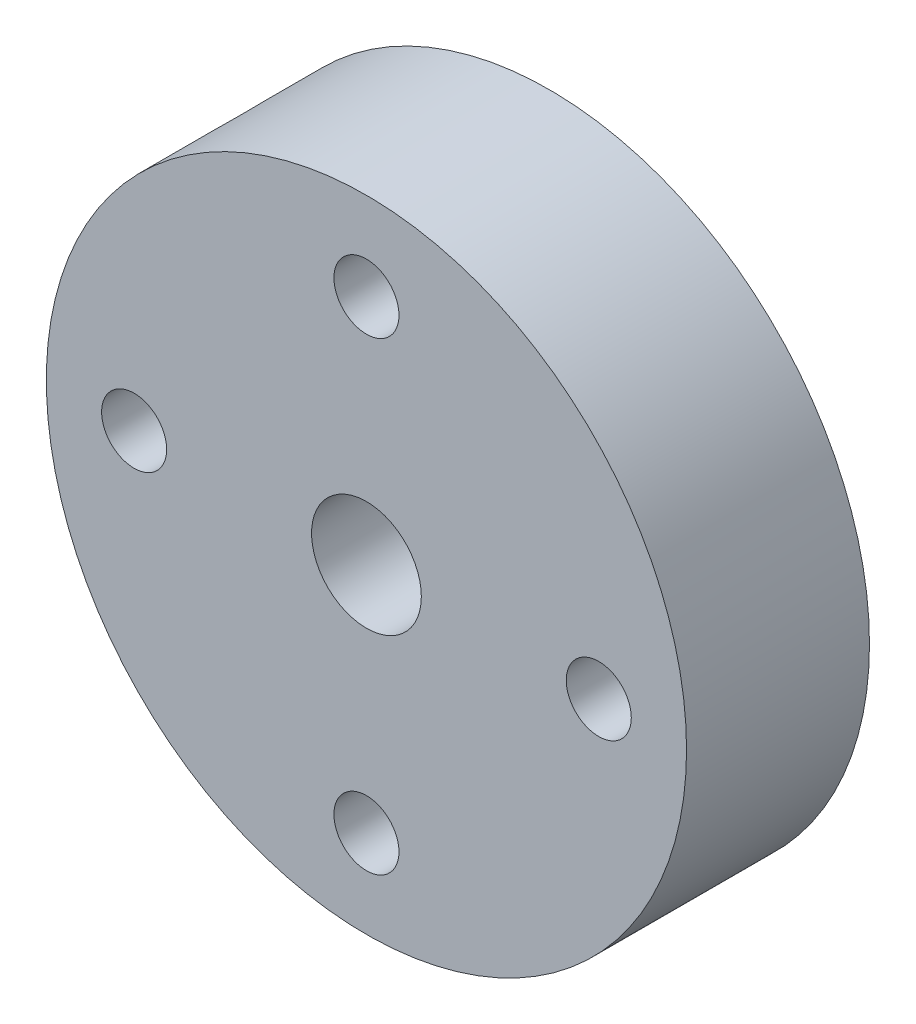
ISO-10303-21;
HEADER;
FILE_DESCRIPTION(('STEP AP214'),'2;1');
FILE_NAME('part.step','',(''),(''),'','','');
FILE_SCHEMA(('AUTOMOTIVE_DESIGN { 1 0 10303 214 1 1 1 1 }'));
ENDSEC;
DATA;
#1=APPLICATION_CONTEXT('core data for automotive mechanical design processes');
#2=APPLICATION_PROTOCOL_DEFINITION('international standard','automotive_design',2000,#1);
#3=PRODUCT_CONTEXT('',#1,'mechanical');
#4=PRODUCT('Part','Part','',(#3));
#5=PRODUCT_RELATED_PRODUCT_CATEGORY('part','',(#4));
#6=PRODUCT_DEFINITION_FORMATION('','',#4);
#7=PRODUCT_DEFINITION_CONTEXT('part definition',#1,'design');
#8=PRODUCT_DEFINITION('design','',#6,#7);
#9=PRODUCT_DEFINITION_SHAPE('','',#8);
#10=(LENGTH_UNIT() NAMED_UNIT(*) SI_UNIT(.MILLI.,.METRE.));
#11=(NAMED_UNIT(*) PLANE_ANGLE_UNIT() SI_UNIT($,.RADIAN.));
#12=(NAMED_UNIT(*) SI_UNIT($,.STERADIAN.) SOLID_ANGLE_UNIT());
#13=UNCERTAINTY_MEASURE_WITH_UNIT(LENGTH_MEASURE(1.E-05),#10,'distance_accuracy_value','');
#14=(GEOMETRIC_REPRESENTATION_CONTEXT(3) GLOBAL_UNCERTAINTY_ASSIGNED_CONTEXT((#13)) GLOBAL_UNIT_ASSIGNED_CONTEXT((#10,
#11,#12)) REPRESENTATION_CONTEXT('',''));
#15=CARTESIAN_POINT('',(0.,0.,0.));
#16=DIRECTION('',(0.,0.,1.));
#17=DIRECTION('',(1.,0.,0.));
#18=AXIS2_PLACEMENT_3D('',#15,#16,#17);
#19=CARTESIAN_POINT('',(0.,0.,5.));
#20=DIRECTION('',(0.,0.,1.));
#21=DIRECTION('',(1.,0.,0.));
#22=AXIS2_PLACEMENT_3D('',#19,#20,#21);
#23=PLANE('',#22);
#24=CARTESIAN_POINT('',(-6.35,0.,5.));
#25=DIRECTION('',(0.,0.,1.));
#26=DIRECTION('',(1.,0.,0.));
#27=AXIS2_PLACEMENT_3D('',#24,#25,#26);
#28=CIRCLE('',#27,0.888999999999987);
#29=CARTESIAN_POINT('',(-5.46100000000001,0.,5.));
#30=VERTEX_POINT('',#29);
#31=EDGE_CURVE('E105',#30,#30,#28,.T.);
#32=ORIENTED_EDGE('',*,*,#31,.F.);
#33=EDGE_LOOP('',(#32));
#34=FACE_BOUND('',#33,.T.);
#35=CARTESIAN_POINT('',(0.,6.35,5.));
#36=DIRECTION('',(0.,0.,1.));
#37=DIRECTION('',(1.,0.,0.));
#38=AXIS2_PLACEMENT_3D('',#35,#36,#37);
#39=CIRCLE('',#38,0.888999999999987);
#40=CARTESIAN_POINT('',(0.888999999999987,6.35,5.));
#41=VERTEX_POINT('',#40);
#42=EDGE_CURVE('E111',#41,#41,#39,.T.);
#43=ORIENTED_EDGE('',*,*,#42,.F.);
#44=EDGE_LOOP('',(#43));
#45=FACE_BOUND('',#44,.T.);
#46=CARTESIAN_POINT('',(6.35,0.,5.));
#47=DIRECTION('',(0.,0.,1.));
#48=DIRECTION('',(1.,0.,0.));
#49=AXIS2_PLACEMENT_3D('',#46,#47,#48);
#50=CIRCLE('',#49,0.888999999999987);
#51=CARTESIAN_POINT('',(7.23899999999999,0.,5.));
#52=VERTEX_POINT('',#51);
#53=EDGE_CURVE('E117',#52,#52,#50,.T.);
#54=ORIENTED_EDGE('',*,*,#53,.F.);
#55=EDGE_LOOP('',(#54));
#56=FACE_BOUND('',#55,.T.);
#57=CARTESIAN_POINT('',(0.,-6.35,5.));
#58=DIRECTION('',(0.,0.,1.));
#59=DIRECTION('',(1.,0.,0.));
#60=AXIS2_PLACEMENT_3D('',#57,#58,#59);
#61=CIRCLE('',#60,0.888999999999987);
#62=CARTESIAN_POINT('',(0.888999999999987,-6.35,5.));
#63=VERTEX_POINT('',#62);
#64=EDGE_CURVE('E123',#63,#63,#61,.T.);
#65=ORIENTED_EDGE('',*,*,#64,.F.);
#66=EDGE_LOOP('',(#65));
#67=FACE_BOUND('',#66,.T.);
#68=CARTESIAN_POINT('',(0.,0.,5.));
#69=DIRECTION('',(0.,0.,1.));
#70=DIRECTION('',(1.,0.,0.));
#71=AXIS2_PLACEMENT_3D('',#68,#69,#70);
#72=CIRCLE('',#71,8.75);
#73=CARTESIAN_POINT('',(8.75,0.,5.));
#74=VERTEX_POINT('',#73);
#75=EDGE_CURVE('E136',#74,#74,#72,.T.);
#76=ORIENTED_EDGE('',*,*,#75,.T.);
#77=EDGE_LOOP('',(#76));
#78=FACE_BOUND('',#77,.T.);
#79=CARTESIAN_POINT('',(0.,0.,5.));
#80=DIRECTION('',(0.,0.,1.));
#81=DIRECTION('',(1.,0.,0.));
#82=AXIS2_PLACEMENT_3D('',#79,#80,#81);
#83=CIRCLE('',#82,1.5);
#84=CARTESIAN_POINT('',(1.5,0.,5.));
#85=VERTEX_POINT('',#84);
#86=EDGE_CURVE('E130',#85,#85,#83,.T.);
#87=ORIENTED_EDGE('',*,*,#86,.F.);
#88=EDGE_LOOP('',(#87));
#89=FACE_BOUND('',#88,.T.);
#90=ADVANCED_FACE('F34',(#34,#45,#56,#67,#78,#89),#23,.T.);
#91=CARTESIAN_POINT('',(0.,0.,0.));
#92=DIRECTION('',(0.,0.,1.));
#93=DIRECTION('',(1.,0.,0.));
#94=AXIS2_PLACEMENT_3D('',#91,#92,#93);
#95=PLANE('',#94);
#96=CARTESIAN_POINT('',(-6.35,0.,0.));
#97=DIRECTION('',(0.,0.,1.));
#98=DIRECTION('',(1.,0.,0.));
#99=AXIS2_PLACEMENT_3D('',#96,#97,#98);
#100=CIRCLE('',#99,0.888999999999999);
#101=CARTESIAN_POINT('',(-5.461,0.,0.));
#102=VERTEX_POINT('',#101);
#103=EDGE_CURVE('E108',#102,#102,#100,.T.);
#104=ORIENTED_EDGE('',*,*,#103,.T.);
#105=EDGE_LOOP('',(#104));
#106=FACE_BOUND('',#105,.T.);
#107=CARTESIAN_POINT('',(0.,6.35,0.));
#108=DIRECTION('',(0.,0.,1.));
#109=DIRECTION('',(1.,0.,0.));
#110=AXIS2_PLACEMENT_3D('',#107,#108,#109);
#111=CIRCLE('',#110,0.888999999999999);
#112=CARTESIAN_POINT('',(0.888999999999999,6.35,0.));
#113=VERTEX_POINT('',#112);
#114=EDGE_CURVE('E114',#113,#113,#111,.T.);
#115=ORIENTED_EDGE('',*,*,#114,.T.);
#116=EDGE_LOOP('',(#115));
#117=FACE_BOUND('',#116,.T.);
#118=CARTESIAN_POINT('',(6.35,0.,0.));
#119=DIRECTION('',(0.,0.,1.));
#120=DIRECTION('',(1.,0.,0.));
#121=AXIS2_PLACEMENT_3D('',#118,#119,#120);
#122=CIRCLE('',#121,0.888999999999999);
#123=CARTESIAN_POINT('',(7.239,0.,0.));
#124=VERTEX_POINT('',#123);
#125=EDGE_CURVE('E120',#124,#124,#122,.T.);
#126=ORIENTED_EDGE('',*,*,#125,.T.);
#127=EDGE_LOOP('',(#126));
#128=FACE_BOUND('',#127,.T.);
#129=CARTESIAN_POINT('',(0.,-6.35,0.));
#130=DIRECTION('',(0.,0.,1.));
#131=DIRECTION('',(1.,0.,0.));
#132=AXIS2_PLACEMENT_3D('',#129,#130,#131);
#133=CIRCLE('',#132,0.888999999999999);
#134=CARTESIAN_POINT('',(0.888999999999999,-6.35,0.));
#135=VERTEX_POINT('',#134);
#136=EDGE_CURVE('E126',#135,#135,#133,.T.);
#137=ORIENTED_EDGE('',*,*,#136,.T.);
#138=EDGE_LOOP('',(#137));
#139=FACE_BOUND('',#138,.T.);
#140=CARTESIAN_POINT('',(0.,0.,0.));
#141=DIRECTION('',(0.,0.,1.));
#142=DIRECTION('',(1.,0.,0.));
#143=AXIS2_PLACEMENT_3D('',#140,#141,#142);
#144=CIRCLE('',#143,8.75);
#145=CARTESIAN_POINT('',(8.75,0.,0.));
#146=VERTEX_POINT('',#145);
#147=EDGE_CURVE('E133',#146,#146,#144,.T.);
#148=ORIENTED_EDGE('',*,*,#147,.F.);
#149=EDGE_LOOP('',(#148));
#150=FACE_BOUND('',#149,.T.);
#151=CARTESIAN_POINT('',(0.,0.,0.));
#152=DIRECTION('',(0.,0.,1.));
#153=DIRECTION('',(1.,0.,0.));
#154=AXIS2_PLACEMENT_3D('',#151,#152,#153);
#155=CIRCLE('',#154,1.5);
#156=CARTESIAN_POINT('',(1.5,0.,0.));
#157=VERTEX_POINT('',#156);
#158=EDGE_CURVE('E129',#157,#157,#155,.T.);
#159=ORIENTED_EDGE('',*,*,#158,.T.);
#160=EDGE_LOOP('',(#159));
#161=FACE_BOUND('',#160,.T.);
#162=ADVANCED_FACE('F148',(#106,#117,#128,#139,#150,#161),#95,.F.);
#163=CARTESIAN_POINT('',(0.,0.,5.));
#164=DIRECTION('',(0.,0.,-1.));
#165=DIRECTION('',(-1.,0.,0.));
#166=AXIS2_PLACEMENT_3D('',#163,#164,#165);
#167=CYLINDRICAL_SURFACE('',#166,8.75);
#168=CARTESIAN_POINT('',(-7.42074447105529,4.63627560605518,2.40860037984043));
#169=CARTESIAN_POINT('',(-7.42074349335619,4.63627826688642,2.3453957615485));
#170=CARTESIAN_POINT('',(-7.41790610698934,4.64082824145288,2.28215207383016));
#171=CARTESIAN_POINT('',(-7.40658775349803,4.65886970046871,2.15742603668857));
#172=CARTESIAN_POINT('',(-7.3981009497547,4.67237043221304,2.09594557751276));
#173=CARTESIAN_POINT('',(-7.37560620743148,4.70779890727105,1.97656981299998));
#174=CARTESIAN_POINT('',(-7.36160209157064,4.72972081563523,1.91867205742373));
#175=CARTESIAN_POINT('',(-7.32827719875934,4.78119115102323,1.80804285632493));
#176=CARTESIAN_POINT('',(-7.30895730315708,4.81073831374109,1.75531055634128));
#177=CARTESIAN_POINT('',(-7.26517688651634,4.87660459427423,1.6561840457202));
#178=CARTESIAN_POINT('',(-7.24068950655094,4.91295897800324,1.60982512670236));
#179=CARTESIAN_POINT('',(-7.18704709245415,4.99110163531383,1.52506634373632));
#180=CARTESIAN_POINT('',(-7.15789182258028,5.03289018331703,1.48666688198954));
#181=CARTESIAN_POINT('',(-7.09535178281155,5.12068291829894,1.41878982244841));
#182=CARTESIAN_POINT('',(-7.06195241861171,5.16670149252692,1.38934426009379));
#183=CARTESIAN_POINT('',(-6.99172471865341,5.26134525279714,1.34041609936149));
#184=CARTESIAN_POINT('',(-6.95489651851652,5.30997033571127,1.32093310712964));
#185=CARTESIAN_POINT('',(-6.87891923042884,5.40803050241127,1.29258884512203));
#186=CARTESIAN_POINT('',(-6.83978426406936,5.45745954032837,1.28366882008107));
#187=CARTESIAN_POINT('',(-6.76005622298589,5.55591136629063,1.27652155418463));
#188=CARTESIAN_POINT('',(-6.71946320936741,5.60493417125494,1.27829386574111));
#189=CARTESIAN_POINT('',(-6.63824477115278,5.70088900213565,1.29243398797317));
#190=CARTESIAN_POINT('',(-6.59762098072273,5.74783174500636,1.30473860568923));
#191=CARTESIAN_POINT('',(-6.51734742983352,5.8386950680936,1.33949521043651));
#192=CARTESIAN_POINT('',(-6.47769768896349,5.88261558756209,1.3619474013699));
#193=CARTESIAN_POINT('',(-6.40054112304636,5.96647573406324,1.41642862806382));
#194=CARTESIAN_POINT('',(-6.36304075745273,6.00640360507014,1.44848489544796));
#195=CARTESIAN_POINT('',(-6.29157187714166,6.08122556984663,1.52124449509745));
#196=CARTESIAN_POINT('',(-6.25760353547958,6.11611941700112,1.56194825075889));
#197=CARTESIAN_POINT('',(-6.19416329348301,6.1803639424942,1.65120104112264));
#198=CARTESIAN_POINT('',(-6.16472601924222,6.20967230602866,1.69980516549267));
#199=CARTESIAN_POINT('',(-6.11174535290626,6.26182522442874,1.80329007923406));
#200=CARTESIAN_POINT('',(-6.08820198162388,6.28466975646908,1.8581708907689));
#201=CARTESIAN_POINT('',(-6.04791642272135,6.3234478698719,1.97270130889544));
#202=CARTESIAN_POINT('',(-6.03117745443647,6.33937818018191,2.03235315684964));
#203=CARTESIAN_POINT('',(-6.00519792971186,6.36399411298746,2.15470617318031));
#204=CARTESIAN_POINT('',(-5.99595698643103,6.37268010923517,2.21740718406623));
#205=CARTESIAN_POINT('',(-5.98539721111837,6.38259925198196,2.34359522661232));
#206=CARTESIAN_POINT('',(-5.9840218101229,6.38388561700841,2.40707334659147));
#207=CARTESIAN_POINT('',(-5.98909883627257,6.37912272724167,2.5334372532825));
#208=CARTESIAN_POINT('',(-5.99555108492929,6.3730736397137,2.59632305346769));
#209=CARTESIAN_POINT('',(-6.01597756648036,6.35379476838012,2.71948517064868));
#210=CARTESIAN_POINT('',(-6.02992449923048,6.34059104460943,2.77977010591045));
#211=CARTESIAN_POINT('',(-6.06476140890131,6.30727726544391,2.89628917424419));
#212=CARTESIAN_POINT('',(-6.08565164538373,6.28716695185891,2.9525231557836));
#213=CARTESIAN_POINT('',(-6.1337009271772,6.24029977910215,3.05969206710684));
#214=CARTESIAN_POINT('',(-6.16089461068835,6.21350612990522,3.11059537394109));
#215=CARTESIAN_POINT('',(-6.22046540945471,6.15386723931582,3.20533494587723));
#216=CARTESIAN_POINT('',(-6.25284274032272,6.12102174618951,3.24917091686237));
#217=CARTESIAN_POINT('',(-6.32182863076091,6.0497481531361,3.3288030142167));
#218=CARTESIAN_POINT('',(-6.3584618013876,6.01128721429959,3.36454845450163));
#219=CARTESIAN_POINT('',(-6.4345193336663,5.92980292352496,3.4266337207497));
#220=CARTESIAN_POINT('',(-6.47394363579218,5.88677966887706,3.45297374722861));
#221=CARTESIAN_POINT('',(-6.55414776018111,5.79734779641252,3.4954172069732));
#222=CARTESIAN_POINT('',(-6.59492338539464,5.75094920756419,3.51154968732589));
#223=CARTESIAN_POINT('',(-6.6766370007185,5.65587703456791,3.5332145370685));
#224=CARTESIAN_POINT('',(-6.71757498288826,5.60720356045439,3.53874741861037));
#225=CARTESIAN_POINT('',(-6.79809018253443,5.50930647379819,3.5390459890491));
#226=CARTESIAN_POINT('',(-6.83767513447509,5.46008944216819,3.53388973836406));
#227=CARTESIAN_POINT('',(-6.91471153174845,5.36219594414664,3.51312204770064));
#228=CARTESIAN_POINT('',(-6.95216297928697,5.31351947719625,3.49751061853202));
#229=CARTESIAN_POINT('',(-7.02398904250206,5.21820282553661,3.456300743498));
#230=CARTESIAN_POINT('',(-7.05836488427025,5.171561833217,3.43070629937135));
#231=CARTESIAN_POINT('',(-7.12329973274398,5.08174927550848,3.37026502816748));
#232=CARTESIAN_POINT('',(-7.15385868162624,5.0385777626833,3.33541806094595));
#233=CARTESIAN_POINT('',(-7.21076413248581,4.95680174925694,3.25717305565935));
#234=CARTESIAN_POINT('',(-7.23707971857698,4.91823125666104,3.21371698687579));
#235=CARTESIAN_POINT('',(-7.28478311226648,4.84729483898947,3.11960832425718));
#236=CARTESIAN_POINT('',(-7.30616975334795,4.81493038297943,3.06895403141876));
#237=CARTESIAN_POINT('',(-7.34374572510657,4.75742442268737,2.9616460624697));
#238=CARTESIAN_POINT('',(-7.35991326512837,4.73231324683801,2.90496851344501));
#239=CARTESIAN_POINT('',(-7.38667566746876,4.69043130417856,2.78742231168893));
#240=CARTESIAN_POINT('',(-7.39727654849847,4.67365153047136,2.72655826631875));
#241=CARTESIAN_POINT('',(-7.41025525161376,4.6530321853717,2.62258782046342));
#242=CARTESIAN_POINT('',(-7.41418562639288,4.64675975275288,2.58013530109802));
#243=CARTESIAN_POINT('',(-7.41943055811197,4.63838057447738,2.49466135011548));
#244=CARTESIAN_POINT('',(-7.42074513682504,4.63627379414705,2.45163992323675));
#245=CARTESIAN_POINT('',(-7.42074447105529,4.63627560605518,2.40860037984043));
#246=B_SPLINE_CURVE_WITH_KNOTS('',3,(#168,#169,#170,#171,#172,#173,#174,#175,#176,#177,#178,
#179,#180,#181,#182,#183,#184,#185,#186,#187,#188,#189,#190,#191,#192,#193,#194,#195,#196,#197,
#198,#199,#200,#201,#202,#203,#204,#205,#206,#207,#208,#209,#210,#211,#212,#213,#214,#215,#216,
#217,#218,#219,#220,#221,#222,#223,#224,#225,#226,#227,#228,#229,#230,#231,#232,#233,#234,#235,
#236,#237,#238,#239,#240,#241,#242,#243,#244,#245),.UNSPECIFIED.,.T.,.F.,(4,2,2,2,2,2,2,2,2,2,2,
2,2,2,2,2,2,2,2,2,2,2,2,2,2,2,2,2,2,2,2,2,2,2,2,2,2,2,4),(0.,0.189456611896127,
0.379109262733929,0.568630741473313,0.758120816754088,0.948621190947888,1.13913118902053,
1.33031498812181,1.52149122849496,1.71159900237084,1.90169881826908,2.09066598253013,
2.27963694400709,2.46914887239099,2.65867008174833,2.8495744884028,3.04047956917674,
3.23147486714379,3.42246031057908,3.61207044272537,3.80167625140533,3.99059603756527,
4.17952288691315,4.36951361242549,4.55951224261922,4.75067012804062,4.94182393788816,
5.13243131542376,5.32302948295026,5.51224065781188,5.70145163704554,5.89058684798296,
6.07972492384042,6.27018416856078,6.46068844244857,6.65197811548045,6.84306053668465,
6.97207316524206,7.10108471993195),.UNSPECIFIED.);
#247=CARTESIAN_POINT('',(-7.42074447105529,4.63627560605518,2.40860037984043));
#248=VERTEX_POINT('',#247);
#249=EDGE_CURVE('E100',#248,#248,#246,.T.);
#250=ORIENTED_EDGE('',*,*,#249,.T.);
#251=EDGE_LOOP('',(#250));
#252=FACE_BOUND('',#251,.T.);
#253=ORIENTED_EDGE('',*,*,#75,.F.);
#254=EDGE_LOOP('',(#253));
#255=FACE_BOUND('',#254,.T.);
#256=ORIENTED_EDGE('',*,*,#147,.T.);
#257=EDGE_LOOP('',(#256));
#258=FACE_BOUND('',#257,.T.);
#259=ADVANCED_FACE('F36',(#252,#255,#258),#167,.T.);
#260=CARTESIAN_POINT('',(0.,0.,5.));
#261=DIRECTION('',(0.,0.,-1.));
#262=DIRECTION('',(-1.,0.,0.));
#263=AXIS2_PLACEMENT_3D('',#260,#261,#262);
#264=CYLINDRICAL_SURFACE('',#263,1.5);
#265=CARTESIAN_POINT('',(-1.45606434492878,0.36038399441028,3.76516037984043));
#266=CARTESIAN_POINT('',(-1.46411979481047,0.327741680317255,3.72394054081149));
#267=CARTESIAN_POINT('',(-1.47066991736468,0.296668598510387,3.68126574590982));
#268=CARTESIAN_POINT('',(-1.48136057495956,0.23766830241184,3.59358599212343));
#269=CARTESIAN_POINT('',(-1.48550450726308,0.209736697895313,3.54858441669694));
#270=CARTESIAN_POINT('',(-1.492015353778,0.156835867238761,3.45653951642151));
#271=CARTESIAN_POINT('',(-1.49437556720853,0.131878105423725,3.40948918794055));
#272=CARTESIAN_POINT('',(-1.49776717558925,0.0851053184141833,3.31379758798309));
#273=CARTESIAN_POINT('',(-1.49879791242233,0.0632918544509973,3.26515554078091));
#274=CARTESIAN_POINT('',(-1.50061794445603,0.000229898848000785,3.11096212267964));
#275=CARTESIAN_POINT('',(-1.49983226505023,-0.0352889180845567,3.00292628222897));
#276=CARTESIAN_POINT('',(-1.49814875515998,-0.0756522583627248,2.83795766415221));
#277=CARTESIAN_POINT('',(-1.49750402865718,-0.0869509260723791,2.78252093360349));
#278=CARTESIAN_POINT('',(-1.49635181980297,-0.104953110890781,2.67091098669097));
#279=CARTESIAN_POINT('',(-1.49584427213489,-0.111658817244932,2.61473813423221));
#280=CARTESIAN_POINT('',(-1.49515174462365,-0.120597674712916,2.4973956419894));
#281=CARTESIAN_POINT('',(-1.49499663167242,-0.12241893797212,2.43619400909573));
#282=CARTESIAN_POINT('',(-1.49516611329795,-0.120329406110543,2.31388597895297));
#283=CARTESIAN_POINT('',(-1.49549074640084,-0.116418150638641,2.25277958974696));
#284=CARTESIAN_POINT('',(-1.49647307856124,-0.103018552366682,2.13103384341681));
#285=CARTESIAN_POINT('',(-1.49713162201298,-0.0935160605963493,2.07039606796377));
#286=CARTESIAN_POINT('',(-1.49844820152996,-0.0692768245699171,1.95015945584046));
#287=CARTESIAN_POINT('',(-1.49910623724911,-0.0545378014620082,1.89056108336618));
#288=CARTESIAN_POINT('',(-1.49993322942053,-0.0213800944596266,1.77667092581499));
#289=CARTESIAN_POINT('',(-1.50013172235808,-0.00327020303068468,1.72228930967897));
#290=CARTESIAN_POINT('',(-1.49968040906872,0.0368436678736821,1.61501212038926));
#291=CARTESIAN_POINT('',(-1.4990305420759,0.0588479261953515,1.56211665396201));
#292=CARTESIAN_POINT('',(-1.49510486123715,0.130214272118415,1.40630675150141));
#293=CARTESIAN_POINT('',(-1.48986460592546,0.185073748282528,1.30578550215695));
#294=CARTESIAN_POINT('',(-1.47657911262111,0.264635137992596,1.18312018088314));
#295=CARTESIAN_POINT('',(-1.47319751798899,0.282951905424005,1.15619321867697));
#296=CARTESIAN_POINT('',(-1.46542794432411,0.320770209657077,1.10333502046181));
#297=CARTESIAN_POINT('',(-1.46103991356654,0.34027180731405,1.07740383570983));
#298=CARTESIAN_POINT('',(-1.45606434492878,0.36038399441028,1.05204037984043));
#299=B_SPLINE_CURVE_WITH_KNOTS('',3,(#265,#266,#267,#268,#269,#270,#271,#272,#273,#274,#275,
#276,#277,#278,#279,#280,#281,#282,#283,#284,#285,#286,#287,#288,#289,#290,#291,#292,#293,#294,
#295,#296,#297,#298),.UNSPECIFIED.,.F.,.F.,(4,2,2,2,2,2,2,2,2,2,2,2,2,2,2,2,4),(0.,
0.15942164184693,0.318617647975622,0.478408762723388,0.638278946902449,0.977929805525029,
1.1475251402367,1.31703958058766,1.50045570038588,1.68388655026118,1.86778359183641,
2.05176076058659,2.22353884615357,2.39532923643365,2.73740887051102,2.83559546599267,
2.93378710880977),.UNSPECIFIED.);
#300=CARTESIAN_POINT('',(-1.4993382346659,-0.0445517459695279,2.96039571327485));
#301=VERTEX_POINT('',#300);
#302=CARTESIAN_POINT('',(-1.4993382346659,-0.0445517459695279,1.85680504640601));
#303=VERTEX_POINT('',#302);
#304=EDGE_CURVE('E11',#301,#303,#299,.T.);
#305=ORIENTED_EDGE('',*,*,#304,.F.);
#306=CARTESIAN_POINT('',(-0.24658774680386,1.47959267473389,2.96039571327485));
#307=CARTESIAN_POINT('',(-0.268346077511125,1.47596933437987,2.99007802354036));
#308=CARTESIAN_POINT('',(-0.291198495314413,1.47166430557634,3.01884016261404));
#309=CARTESIAN_POINT('',(-0.338735103421876,1.46145411553568,3.07451721792471));
#310=CARTESIAN_POINT('',(-0.363419614362842,1.45554867372662,3.10143180922612));
#311=CARTESIAN_POINT('',(-0.440179319669549,1.43494312584743,3.17989494692369));
#312=CARTESIAN_POINT('',(-0.494514334056852,1.41741604659015,3.22857225736136));
#313=CARTESIAN_POINT('',(-0.606655670242271,1.37317971577317,3.31738108952355));
#314=CARTESIAN_POINT('',(-0.664471467300671,1.34644437024302,3.35748779513697));
#315=CARTESIAN_POINT('',(-0.780524799551932,1.2826212790986,3.4270501264846));
#316=CARTESIAN_POINT('',(-0.838758468354703,1.24558922549482,3.45656114681152));
#317=CARTESIAN_POINT('',(-0.935686536858526,1.17345479627391,3.49607938678463));
#318=CARTESIAN_POINT('',(-0.975074052782403,1.14101015700185,3.50927247878946));
#319=CARTESIAN_POINT('',(-1.05121477661227,1.071263240264,3.52871143531332));
#320=CARTESIAN_POINT('',(-1.08796855653364,1.03396202257568,3.53495881266146));
#321=CARTESIAN_POINT('',(-1.15762820153718,0.955333131940583,3.54011995224817));
#322=CARTESIAN_POINT('',(-1.19052685326315,0.913998168050867,3.53902018330635));
#323=CARTESIAN_POINT('',(-1.25143185518693,0.828654312156499,3.52952789489688));
#324=CARTESIAN_POINT('',(-1.2794374411481,0.784645003896363,3.5211342374344));
#325=CARTESIAN_POINT('',(-1.32944144008236,0.696487116797027,3.49784213423515));
#326=CARTESIAN_POINT('',(-1.35156925355412,0.652367891255432,3.48310665649445));
#327=CARTESIAN_POINT('',(-1.39069134789553,0.564187407764091,3.44786230405519));
#328=CARTESIAN_POINT('',(-1.40768450104954,0.520126164661487,3.42735216298636));
#329=CARTESIAN_POINT('',(-1.43857446623617,0.427945161461282,3.3785597356645));
#330=CARTESIAN_POINT('',(-1.45186894807544,0.379960316767908,3.34964577546268));
#331=CARTESIAN_POINT('',(-1.47317535577295,0.286459844297427,3.28635138712198));
#332=CARTESIAN_POINT('',(-1.48118095710545,0.240947232299477,3.25196447506849));
#333=CARTESIAN_POINT('',(-1.49292204633595,0.152387532600661,3.17747523744268));
#334=CARTESIAN_POINT('',(-1.49655311233108,0.109423175531437,3.13725789606698));
#335=CARTESIAN_POINT('',(-1.49934752522084,0.0486614580075555,3.07348024431895));
#336=CARTESIAN_POINT('',(-1.49983804137175,0.0290447827846579,3.05167629832243));
#337=CARTESIAN_POINT('',(-1.50009378922677,-0.00882068348760373,3.00690666593829));
#338=CARTESIAN_POINT('',(-1.49985899282104,-0.0270694214938512,2.98394093455907));
#339=CARTESIAN_POINT('',(-1.4993382346659,-0.0445517459695272,2.96039571327486));
#340=B_SPLINE_CURVE_WITH_KNOTS('',3,(#306,#307,#308,#309,#310,#311,#312,#313,#314,#315,#316,
#317,#318,#319,#320,#321,#322,#323,#324,#325,#326,#327,#328,#329,#330,#331,#332,#333,#334,#335,
#336,#337,#338,#339),.UNSPECIFIED.,.F.,.F.,(4,2,2,2,2,2,2,2,2,2,2,2,2,2,2,2,4),(0.,
0.110858468579524,0.221736384588506,0.44569486344725,0.670293279667123,0.893699776538168,
1.05115340804588,1.20857273824102,1.36628206617432,1.52401600438596,1.67791825673121,
1.83185428580629,2.00396233096663,2.17627581486431,2.35262580062277,2.44057267001952,
2.52852294788081),.UNSPECIFIED.);
#341=CARTESIAN_POINT('',(-0.246587746803859,1.47959267473389,2.96039571327485));
#342=VERTEX_POINT('',#341);
#343=EDGE_CURVE('E67',#342,#301,#340,.T.);
#344=ORIENTED_EDGE('',*,*,#343,.F.);
#345=CARTESIAN_POINT('',(-0.635482480679107,1.35873544766814,1.05204037984043));
#346=CARTESIAN_POINT('',(-0.605017513991083,1.37295855375793,1.09326021886937));
#347=CARTESIAN_POINT('',(-0.575800629457325,1.38540098827022,1.13593501377104));
#348=CARTESIAN_POINT('',(-0.519986664006765,1.40731277414474,1.22361476755743));
#349=CARTESIAN_POINT('',(-0.493385933705729,1.41678630850396,1.26861634298392));
#350=CARTESIAN_POINT('',(-0.442746735496267,1.43341642008498,1.36066124325935));
#351=CARTESIAN_POINT('',(-0.418718217596005,1.44056420364147,1.40771157174031));
#352=CARTESIAN_POINT('',(-0.373487168359655,1.45294761177603,1.50340317169777));
#353=CARTESIAN_POINT('',(-0.352286041289936,1.45818228841035,1.55204521889995));
#354=CARTESIAN_POINT('',(-0.290769775362064,1.47217770863874,1.70623863700122));
#355=CARTESIAN_POINT('',(-0.255770949475044,1.47828392145417,1.81427447745189));
#356=CARTESIAN_POINT('',(-0.215845436945406,1.4844472722642,1.97924309552865));
#357=CARTESIAN_POINT('',(-0.204635740771064,1.4860023529552,2.03467982607737));
#358=CARTESIAN_POINT('',(-0.186751119143786,1.48835746499685,2.14628977298989));
#359=CARTESIAN_POINT('',(-0.180074033225475,1.48915785614058,2.20246262544865));
#360=CARTESIAN_POINT('',(-0.171170238283661,1.4902091424103,2.31980511769146));
#361=CARTESIAN_POINT('',(-0.169353405809595,1.49040959102751,2.38100675058513));
#362=CARTESIAN_POINT('',(-0.171436212534071,1.49017129799275,2.50331478072789));
#363=CARTESIAN_POINT('',(-0.175336310831942,1.48973250500635,2.5644211699339));
#364=CARTESIAN_POINT('',(-0.188672548305341,1.48810186697896,2.68616691626405));
#365=CARTESIAN_POINT('',(-0.198122732203165,1.48690811088144,2.74680469171709));
#366=CARTESIAN_POINT('',(-0.222158208124905,1.48350666383862,2.8670413038404));
#367=CARTESIAN_POINT('',(-0.236745735811619,1.48129853133071,2.92663967631468));
#368=CARTESIAN_POINT('',(-0.269436129141062,1.47568999910974,3.04052983386587));
#369=CARTESIAN_POINT('',(-0.287241764249032,1.47237836425424,3.09491145000189));
#370=CARTESIAN_POINT('',(-0.326509191281767,1.46416888821455,3.2021886392916));
#371=CARTESIAN_POINT('',(-0.34797124501098,1.4592709334251,3.25508410571885));
#372=CARTESIAN_POINT('',(-0.417227071763436,1.441601842863,3.41089400817945));
#373=CARTESIAN_POINT('',(-0.470033859924562,1.42583905361621,3.51141525752391));
#374=CARTESIAN_POINT('',(-0.545517445129726,1.39740056860889,3.63408057879772));
#375=CARTESIAN_POINT('',(-0.562832877964827,1.3905365364757,3.66100754100389));
#376=CARTESIAN_POINT('',(-0.598431241472322,1.37559174053907,3.71386573921904));
#377=CARTESIAN_POINT('',(-0.616714221833715,1.36751091420702,3.73979692397103));
#378=CARTESIAN_POINT('',(-0.635482480679107,1.35873544766814,3.76516037984043));
#379=B_SPLINE_CURVE_WITH_KNOTS('',3,(#345,#346,#347,#348,#349,#350,#351,#352,#353,#354,#355,
#356,#357,#358,#359,#360,#361,#362,#363,#364,#365,#366,#367,#368,#369,#370,#371,#372,#373,#374,
#375,#376,#377,#378),.UNSPECIFIED.,.F.,.F.,(4,2,2,2,2,2,2,2,2,2,2,2,2,2,2,2,4),(0.,
0.15942164184693,0.318617647975622,0.478408762723388,0.63827894690245,0.977929805525029,
1.1475251402367,1.31703958058766,1.50045570038588,1.68388655026118,1.86778359183641,
2.05176076058659,2.22353884615357,2.39532923643366,2.73740887051102,2.83559546599267,
2.93378710880977),.UNSPECIFIED.);
#380=CARTESIAN_POINT('',(-0.246587746803859,1.47959267473389,1.85680504640601));
#381=VERTEX_POINT('',#380);
#382=EDGE_CURVE('E74',#381,#342,#379,.T.);
#383=ORIENTED_EDGE('',*,*,#382,.F.);
#384=CARTESIAN_POINT('',(-1.4993382346659,-0.0445517459695268,1.856805046406));
#385=CARTESIAN_POINT('',(-1.499996227057,-0.0225036032699473,1.82712273614049));
#386=CARTESIAN_POINT('',(-1.50019726356789,0.000749909513642401,1.79836059706682));
#387=CARTESIAN_POINT('',(-1.49938414413728,0.0493638573868653,1.74268354175615));
#388=CARTESIAN_POINT('',(-1.49836977501356,0.0747246613693059,1.71576895045473));
#389=CARTESIAN_POINT('',(-1.49301607638525,0.154021438562147,1.63730581275717));
#390=CARTESIAN_POINT('',(-1.48634080581328,0.210721818265906,1.5886285023195));
#391=CARTESIAN_POINT('',(-1.46465394574316,0.329306017659837,1.49981967015731));
#392=CARTESIAN_POINT('',(-1.44961859060828,0.391204185533228,1.45971296454389));
#393=CARTESIAN_POINT('',(-1.40947303089507,0.517418673311631,1.39015063319626));
#394=CARTESIAN_POINT('',(-1.38441671588828,0.581720417103107,1.36063961286934));
#395=CARTESIAN_POINT('',(-1.33241412645283,0.690780753774672,1.32112137289623));
#396=CARTESIAN_POINT('',(-1.30820949551613,0.735704765943733,1.3079282808914));
#397=CARTESIAN_POINT('',(-1.25452446981156,0.82390884881336,1.28848932436753));
#398=CARTESIAN_POINT('',(-1.22504522551885,0.867189275514944,1.2822419470194));
#399=CARTESIAN_POINT('',(-1.16139145365333,0.950754614692245,1.27708080743269));
#400=CARTESIAN_POINT('',(-1.12720837647782,0.99103386195388,1.2781805763745));
#401=CARTESIAN_POINT('',(-1.05527166216359,1.06731034674393,1.28767286478398));
#402=CARTESIAN_POINT('',(-1.01751746867732,1.103306915091,1.29606652224646));
#403=CARTESIAN_POINT('',(-0.940709359360661,1.16943351571766,1.31935862544571));
#404=CARTESIAN_POINT('',(-0.901709295441831,1.19968481661131,1.33409410318641));
#405=CARTESIAN_POINT('',(-0.822772102251116,1.25513980255122,1.36933845562567));
#406=CARTESIAN_POINT('',(-0.7828347692012,1.28034237834662,1.3898485966945));
#407=CARTESIAN_POINT('',(-0.698378881767778,1.32849557531277,1.43864102401636));
#408=CARTESIAN_POINT('',(-0.653876068829861,1.35082914216257,1.46755498421817));
#409=CARTESIAN_POINT('',(-0.566270146240789,1.38983559917283,1.53084937255888));
#410=CARTESIAN_POINT('',(-0.523168770770315,1.4065017005803,1.56523628461237));
#411=CARTESIAN_POINT('',(-0.438558125840573,1.43516722607062,1.63972552223818));
#412=CARTESIAN_POINT('',(-0.397109803735396,1.44704818618747,1.67994286361388));
#413=CARTESIAN_POINT('',(-0.338038905303803,1.46155418557859,1.74372051536191));
#414=CARTESIAN_POINT('',(-0.318888402251253,1.46583352965557,1.76552446135843));
#415=CARTESIAN_POINT('',(-0.281788969320476,1.47341581289981,1.81029409374257));
#416=CARTESIAN_POINT('',(-0.263840086039124,1.47671871421914,1.83325982512179));
#417=CARTESIAN_POINT('',(-0.24658774680386,1.47959267473389,1.856805046406));
#418=B_SPLINE_CURVE_WITH_KNOTS('',3,(#384,#385,#386,#387,#388,#389,#390,#391,#392,#393,#394,
#395,#396,#397,#398,#399,#400,#401,#402,#403,#404,#405,#406,#407,#408,#409,#410,#411,#412,#413,
#414,#415,#416,#417),.UNSPECIFIED.,.F.,.F.,(4,2,2,2,2,2,2,2,2,2,2,2,2,2,2,2,4),(0.,
0.110858468579524,0.221736384588507,0.445694863447251,0.670293279667124,0.893699776538168,
1.05115340804588,1.20857273824102,1.36628206617432,1.52401600438596,1.6779182567312,
1.83185428580628,2.00396233096663,2.1762758148643,2.35262580062277,2.44057267001952,
2.52852294788081),.UNSPECIFIED.);
#419=EDGE_CURVE('E48',#303,#381,#418,.T.);
#420=ORIENTED_EDGE('',*,*,#419,.F.);
#421=EDGE_LOOP('',(#305,#344,#383,#420));
#422=FACE_BOUND('',#421,.T.);
#423=ORIENTED_EDGE('',*,*,#86,.T.);
#424=EDGE_LOOP('',(#423));
#425=FACE_BOUND('',#424,.T.);
#426=ORIENTED_EDGE('',*,*,#158,.F.);
#427=EDGE_LOOP('',(#426));
#428=FACE_BOUND('',#427,.T.);
#429=ADVANCED_FACE('F78',(#422,#425,#428),#264,.F.);
#430=CARTESIAN_POINT('',(0.,-6.35,5.));
#431=DIRECTION('',(0.,0.,1.));
#432=DIRECTION('',(1.,0.,0.));
#433=AXIS2_PLACEMENT_3D('',#430,#431,#432);
#434=CYLINDRICAL_SURFACE('',#433,0.888999999999993);
#435=ORIENTED_EDGE('',*,*,#136,.F.);
#436=EDGE_LOOP('',(#435));
#437=FACE_BOUND('',#436,.T.);
#438=ORIENTED_EDGE('',*,*,#64,.T.);
#439=EDGE_LOOP('',(#438));
#440=FACE_BOUND('',#439,.T.);
#441=ADVANCED_FACE('F167',(#437,#440),#434,.F.);
#442=CARTESIAN_POINT('',(6.35,0.,5.));
#443=DIRECTION('',(0.,0.,1.));
#444=DIRECTION('',(1.,0.,0.));
#445=AXIS2_PLACEMENT_3D('',#442,#443,#444);
#446=CYLINDRICAL_SURFACE('',#445,0.888999999999993);
#447=ORIENTED_EDGE('',*,*,#125,.F.);
#448=EDGE_LOOP('',(#447));
#449=FACE_BOUND('',#448,.T.);
#450=ORIENTED_EDGE('',*,*,#53,.T.);
#451=EDGE_LOOP('',(#450));
#452=FACE_BOUND('',#451,.T.);
#453=ADVANCED_FACE('F174',(#449,#452),#446,.F.);
#454=CARTESIAN_POINT('',(0.,6.35,5.));
#455=DIRECTION('',(0.,0.,1.));
#456=DIRECTION('',(1.,0.,0.));
#457=AXIS2_PLACEMENT_3D('',#454,#455,#456);
#458=CYLINDRICAL_SURFACE('',#457,0.888999999999993);
#459=ORIENTED_EDGE('',*,*,#114,.F.);
#460=EDGE_LOOP('',(#459));
#461=FACE_BOUND('',#460,.T.);
#462=ORIENTED_EDGE('',*,*,#42,.T.);
#463=EDGE_LOOP('',(#462));
#464=FACE_BOUND('',#463,.T.);
#465=ADVANCED_FACE('F210',(#461,#464),#458,.F.);
#466=CARTESIAN_POINT('',(-6.35,0.,5.));
#467=DIRECTION('',(0.,0.,1.));
#468=DIRECTION('',(1.,0.,0.));
#469=AXIS2_PLACEMENT_3D('',#466,#467,#468);
#470=CYLINDRICAL_SURFACE('',#469,0.888999999999993);
#471=ORIENTED_EDGE('',*,*,#103,.F.);
#472=EDGE_LOOP('',(#471));
#473=FACE_BOUND('',#472,.T.);
#474=ORIENTED_EDGE('',*,*,#31,.T.);
#475=EDGE_LOOP('',(#474));
#476=FACE_BOUND('',#475,.T.);
#477=ADVANCED_FACE('F93',(#473,#476),#470,.F.);
#478=CARTESIAN_POINT('',(-6.75966917604441,5.55602129499475,2.40860037984043));
#479=DIRECTION('',(-0.77253362011936,0.634973862285115,0.));
#480=DIRECTION('',(-0.634973862285115,-0.772533620119361,0.));
#481=AXIS2_PLACEMENT_3D('',#478,#479,#480);
#482=CYLINDRICAL_SURFACE('',#481,1.1303);
#483=ORIENTED_EDGE('',*,*,#419,.T.);
#484=CARTESIAN_POINT('',(-0.872962990734882,0.717520464382182,2.40860037984043));
#485=DIRECTION('',(-0.77253362011936,0.634973862285115,0.));
#486=DIRECTION('',(-0.634973862285115,-0.772533620119361,0.));
#487=AXIS2_PLACEMENT_3D('',#484,#485,#486);
#488=CIRCLE('',#487,1.1303);
#489=EDGE_CURVE('E54',#342,#381,#488,.T.);
#490=ORIENTED_EDGE('',*,*,#489,.F.);
#491=ORIENTED_EDGE('',*,*,#343,.T.);
#492=EDGE_CURVE('E70',#303,#301,#488,.T.);
#493=ORIENTED_EDGE('',*,*,#492,.F.);
#494=EDGE_LOOP('',(#483,#490,#491,#493));
#495=FACE_BOUND('',#494,.T.);
#496=ORIENTED_EDGE('',*,*,#249,.F.);
#497=EDGE_LOOP('',(#496));
#498=FACE_BOUND('',#497,.T.);
#499=ADVANCED_FACE('F68',(#495,#498),#482,.F.);
#500=CARTESIAN_POINT('',(-0.872962990734882,0.717520464382182,2.40860037984043));
#501=DIRECTION('',(-0.77253362011936,0.634973862285115,0.));
#502=DIRECTION('',(-0.634973862285115,-0.772533620119361,0.));
#503=AXIS2_PLACEMENT_3D('',#500,#501,#502);
#504=CONICAL_SURFACE('',#503,1.1303,1.02974425867665);
#505=ORIENTED_EDGE('',*,*,#304,.T.);
#506=ORIENTED_EDGE('',*,*,#492,.T.);
#507=EDGE_LOOP('',(#505,#506));
#508=FACE_BOUND('',#507,.T.);
#509=ADVANCED_FACE('F76',(#508),#504,.F.);
#510=ORIENTED_EDGE('',*,*,#382,.T.);
#511=ORIENTED_EDGE('',*,*,#489,.T.);
#512=EDGE_LOOP('',(#510,#511));
#513=FACE_BOUND('',#512,.T.);
#514=ADVANCED_FACE('F94',(#513),#504,.F.);
#515=CLOSED_SHELL('',(#90,#162,#259,#429,#441,#453,#465,#477,#499,#509,#514));
#516=MANIFOLD_SOLID_BREP('B2',#515);
#517=ADVANCED_BREP_SHAPE_REPRESENTATION('',(#18,#516),#14);
#518=SHAPE_DEFINITION_REPRESENTATION(#9,#517);
ENDSEC;
END-ISO-10303-21;
